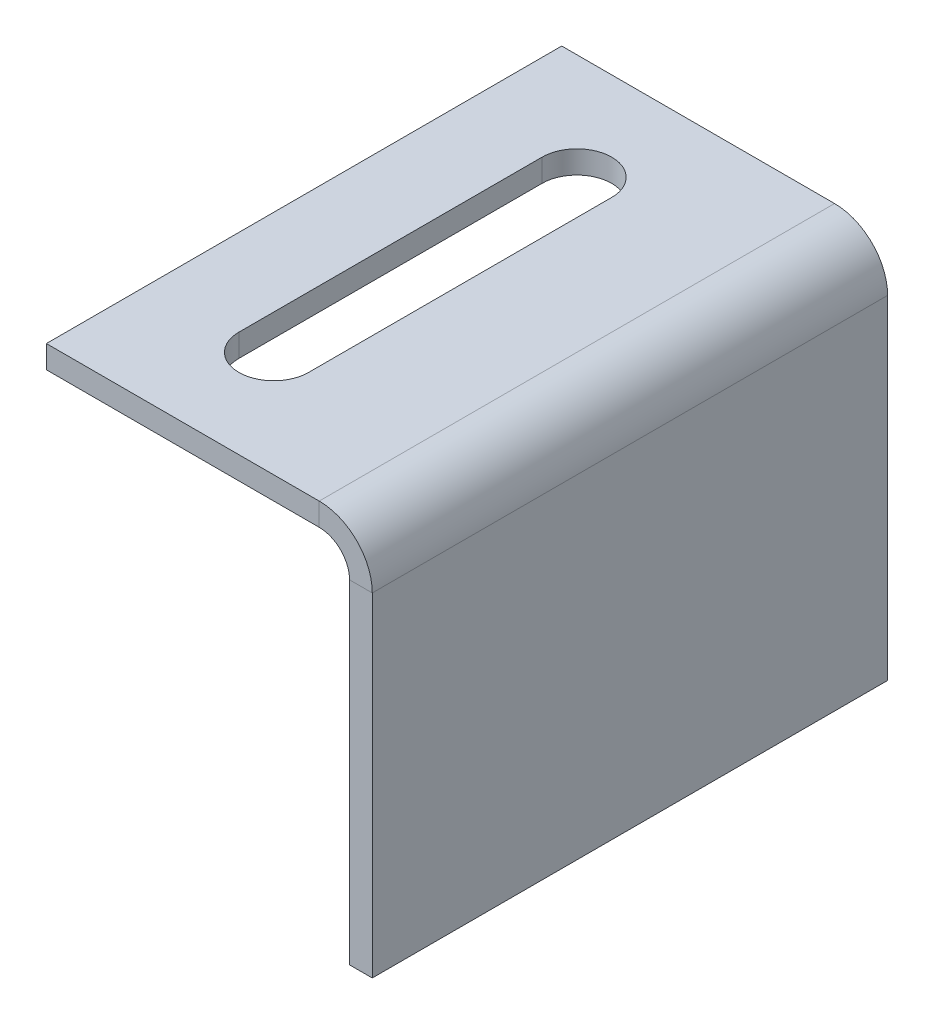
ISO-10303-21;
HEADER;
FILE_DESCRIPTION(('STEP AP214'),'2;1');
FILE_NAME('part.step','',(''),(''),'','','');
FILE_SCHEMA(('AUTOMOTIVE_DESIGN { 1 0 10303 214 1 1 1 1 }'));
ENDSEC;
DATA;
#1=APPLICATION_CONTEXT('core data for automotive mechanical design processes');
#2=APPLICATION_PROTOCOL_DEFINITION('international standard','automotive_design',2000,#1);
#3=PRODUCT_CONTEXT('',#1,'mechanical');
#4=PRODUCT('Part','Part','',(#3));
#5=PRODUCT_RELATED_PRODUCT_CATEGORY('part','',(#4));
#6=PRODUCT_DEFINITION_FORMATION('','',#4);
#7=PRODUCT_DEFINITION_CONTEXT('part definition',#1,'design');
#8=PRODUCT_DEFINITION('design','',#6,#7);
#9=PRODUCT_DEFINITION_SHAPE('','',#8);
#10=(LENGTH_UNIT() NAMED_UNIT(*) SI_UNIT(.MILLI.,.METRE.));
#11=(NAMED_UNIT(*) PLANE_ANGLE_UNIT() SI_UNIT($,.RADIAN.));
#12=(NAMED_UNIT(*) SI_UNIT($,.STERADIAN.) SOLID_ANGLE_UNIT());
#13=UNCERTAINTY_MEASURE_WITH_UNIT(LENGTH_MEASURE(1.E-05),#10,'distance_accuracy_value','');
#14=(GEOMETRIC_REPRESENTATION_CONTEXT(3) GLOBAL_UNCERTAINTY_ASSIGNED_CONTEXT((#13)) GLOBAL_UNIT_ASSIGNED_CONTEXT((#10,
#11,#12)) REPRESENTATION_CONTEXT('',''));
#15=CARTESIAN_POINT('',(0.,0.,0.));
#16=DIRECTION('',(0.,0.,1.));
#17=DIRECTION('',(1.,0.,0.));
#18=AXIS2_PLACEMENT_3D('',#15,#16,#17);
#19=CARTESIAN_POINT('',(-2.,24.,34.));
#20=DIRECTION('',(0.,0.,1.));
#21=DIRECTION('',(1.,0.,0.));
#22=AXIS2_PLACEMENT_3D('',#19,#20,#21);
#23=PLANE('',#22);
#24=DIRECTION('',(0.,1.,0.));
#25=VECTOR('',#24,1.);
#26=CARTESIAN_POINT('',(-2.,24.,34.));
#27=LINE('',#26,#25);
#28=CARTESIAN_POINT('',(-2.,24.,34.));
#29=VERTEX_POINT('',#28);
#30=CARTESIAN_POINT('',(-2.,25.5,34.));
#31=VERTEX_POINT('',#30);
#32=EDGE_CURVE('E223',#29,#31,#27,.T.);
#33=ORIENTED_EDGE('',*,*,#32,.F.);
#34=CARTESIAN_POINT('',(-2.,22.,34.));
#35=DIRECTION('',(0.,0.,-1.));
#36=DIRECTION('',(-1.,0.,0.));
#37=AXIS2_PLACEMENT_3D('',#34,#35,#36);
#38=CIRCLE('',#37,2.);
#39=CARTESIAN_POINT('',(0.,22.,34.));
#40=VERTEX_POINT('',#39);
#41=EDGE_CURVE('E160',#40,#29,#38,.F.);
#42=ORIENTED_EDGE('',*,*,#41,.F.);
#43=DIRECTION('',(-1.,0.,0.));
#44=VECTOR('',#43,1.);
#45=CARTESIAN_POINT('',(1.5,22.,34.));
#46=LINE('',#45,#44);
#47=CARTESIAN_POINT('',(1.5,22.,34.));
#48=VERTEX_POINT('',#47);
#49=EDGE_CURVE('E221',#48,#40,#46,.T.);
#50=ORIENTED_EDGE('',*,*,#49,.F.);
#51=CARTESIAN_POINT('',(-2.,22.,34.));
#52=DIRECTION('',(0.,0.,1.));
#53=DIRECTION('',(1.,0.,0.));
#54=AXIS2_PLACEMENT_3D('',#51,#52,#53);
#55=CIRCLE('',#54,3.5);
#56=EDGE_CURVE('E172',#48,#31,#55,.T.);
#57=ORIENTED_EDGE('',*,*,#56,.T.);
#58=EDGE_LOOP('',(#33,#42,#50,#57));
#59=FACE_BOUND('',#58,.T.);
#60=ADVANCED_FACE('F35',(#59),#23,.T.);
#61=CARTESIAN_POINT('',(1.5,22.,34.));
#62=DIRECTION('',(0.,0.,1.));
#63=DIRECTION('',(1.,0.,0.));
#64=AXIS2_PLACEMENT_3D('',#61,#62,#63);
#65=PLANE('',#64);
#66=DIRECTION('',(-1.,0.,0.));
#67=VECTOR('',#66,1.);
#68=CARTESIAN_POINT('',(0.,24.,34.));
#69=LINE('',#68,#67);
#70=CARTESIAN_POINT('',(-20.,24.,34.));
#71=VERTEX_POINT('',#70);
#72=EDGE_CURVE('E157',#29,#71,#69,.T.);
#73=ORIENTED_EDGE('',*,*,#72,.F.);
#74=ORIENTED_EDGE('',*,*,#32,.T.);
#75=DIRECTION('',(-1.,0.,0.));
#76=VECTOR('',#75,1.);
#77=CARTESIAN_POINT('',(0.,25.5,34.));
#78=LINE('',#77,#76);
#79=CARTESIAN_POINT('',(-20.,25.5,34.));
#80=VERTEX_POINT('',#79);
#81=EDGE_CURVE('E151',#31,#80,#78,.T.);
#82=ORIENTED_EDGE('',*,*,#81,.T.);
#83=DIRECTION('',(0.,1.,0.));
#84=VECTOR('',#83,1.);
#85=CARTESIAN_POINT('',(-20.,24.,34.));
#86=LINE('',#85,#84);
#87=EDGE_CURVE('E153',#71,#80,#86,.T.);
#88=ORIENTED_EDGE('',*,*,#87,.F.);
#89=EDGE_LOOP('',(#73,#74,#82,#88));
#90=FACE_BOUND('',#89,.T.);
#91=ADVANCED_FACE('F250',(#90),#65,.T.);
#92=CARTESIAN_POINT('',(0.,22.,0.));
#93=DIRECTION('',(0.,0.,-1.));
#94=DIRECTION('',(-1.,0.,0.));
#95=AXIS2_PLACEMENT_3D('',#92,#93,#94);
#96=PLANE('',#95);
#97=DIRECTION('',(1.,0.,0.));
#98=VECTOR('',#97,1.);
#99=CARTESIAN_POINT('',(0.,22.,0.));
#100=LINE('',#99,#98);
#101=CARTESIAN_POINT('',(0.,22.,0.));
#102=VERTEX_POINT('',#101);
#103=CARTESIAN_POINT('',(1.5,22.,0.));
#104=VERTEX_POINT('',#103);
#105=EDGE_CURVE('E219',#102,#104,#100,.T.);
#106=ORIENTED_EDGE('',*,*,#105,.F.);
#107=CARTESIAN_POINT('',(-2.,22.,0.));
#108=DIRECTION('',(0.,0.,-1.));
#109=DIRECTION('',(-1.,0.,0.));
#110=AXIS2_PLACEMENT_3D('',#107,#108,#109);
#111=CIRCLE('',#110,2.);
#112=CARTESIAN_POINT('',(-2.,24.,0.));
#113=VERTEX_POINT('',#112);
#114=EDGE_CURVE('E184',#102,#113,#111,.F.);
#115=ORIENTED_EDGE('',*,*,#114,.T.);
#116=DIRECTION('',(0.,-1.,0.));
#117=VECTOR('',#116,1.);
#118=CARTESIAN_POINT('',(-2.,25.5,0.));
#119=LINE('',#118,#117);
#120=CARTESIAN_POINT('',(-2.,25.5,0.));
#121=VERTEX_POINT('',#120);
#122=EDGE_CURVE('E217',#121,#113,#119,.T.);
#123=ORIENTED_EDGE('',*,*,#122,.F.);
#124=CARTESIAN_POINT('',(-2.,22.,0.));
#125=DIRECTION('',(0.,0.,1.));
#126=DIRECTION('',(1.,0.,0.));
#127=AXIS2_PLACEMENT_3D('',#124,#125,#126);
#128=CIRCLE('',#127,3.5);
#129=EDGE_CURVE('E154',#104,#121,#128,.T.);
#130=ORIENTED_EDGE('',*,*,#129,.F.);
#131=EDGE_LOOP('',(#106,#115,#123,#130));
#132=FACE_BOUND('',#131,.T.);
#133=ADVANCED_FACE('F255',(#132),#96,.T.);
#134=CARTESIAN_POINT('',(-2.,25.5,0.));
#135=DIRECTION('',(0.,0.,-1.));
#136=DIRECTION('',(-1.,0.,0.));
#137=AXIS2_PLACEMENT_3D('',#134,#135,#136);
#138=PLANE('',#137);
#139=DIRECTION('',(0.,1.,0.));
#140=VECTOR('',#139,1.);
#141=CARTESIAN_POINT('',(0.,0.,0.));
#142=LINE('',#141,#140);
#143=CARTESIAN_POINT('',(0.,0.,0.));
#144=VERTEX_POINT('',#143);
#145=EDGE_CURVE('E187',#144,#102,#142,.T.);
#146=ORIENTED_EDGE('',*,*,#145,.T.);
#147=ORIENTED_EDGE('',*,*,#105,.T.);
#148=DIRECTION('',(0.,1.,0.));
#149=VECTOR('',#148,1.);
#150=CARTESIAN_POINT('',(1.5,0.,0.));
#151=LINE('',#150,#149);
#152=CARTESIAN_POINT('',(1.5,0.,0.));
#153=VERTEX_POINT('',#152);
#154=EDGE_CURVE('E193',#153,#104,#151,.T.);
#155=ORIENTED_EDGE('',*,*,#154,.F.);
#156=DIRECTION('',(-1.,0.,0.));
#157=VECTOR('',#156,1.);
#158=CARTESIAN_POINT('',(1.5,0.,0.));
#159=LINE('',#158,#157);
#160=EDGE_CURVE('E190',#153,#144,#159,.T.);
#161=ORIENTED_EDGE('',*,*,#160,.T.);
#162=EDGE_LOOP('',(#146,#147,#155,#161));
#163=FACE_BOUND('',#162,.T.);
#164=ADVANCED_FACE('F293',(#163),#138,.T.);
#165=CARTESIAN_POINT('',(0.,25.5,34.));
#166=DIRECTION('',(0.,-1.,0.));
#167=DIRECTION('',(1.,0.,0.));
#168=AXIS2_PLACEMENT_3D('',#165,#166,#167);
#169=PLANE('',#168);
#170=DIRECTION('',(0.,0.,1.));
#171=VECTOR('',#170,1.);
#172=CARTESIAN_POINT('',(-14.3,25.5,7.));
#173=LINE('',#172,#171);
#174=CARTESIAN_POINT('',(-14.3,25.5,7.));
#175=VERTEX_POINT('',#174);
#176=CARTESIAN_POINT('',(-14.3,25.5,27.));
#177=VERTEX_POINT('',#176);
#178=EDGE_CURVE('E134',#175,#177,#173,.T.);
#179=ORIENTED_EDGE('',*,*,#178,.F.);
#180=CARTESIAN_POINT('',(-12.,25.5,7.));
#181=DIRECTION('',(0.,1.,0.));
#182=DIRECTION('',(-1.,0.,0.));
#183=AXIS2_PLACEMENT_3D('',#180,#181,#182);
#184=CIRCLE('',#183,2.3);
#185=CARTESIAN_POINT('',(-9.70000000000001,25.5,7.));
#186=VERTEX_POINT('',#185);
#187=EDGE_CURVE('E49',#186,#175,#184,.T.);
#188=ORIENTED_EDGE('',*,*,#187,.F.);
#189=DIRECTION('',(0.,0.,-1.));
#190=VECTOR('',#189,1.);
#191=CARTESIAN_POINT('',(-9.70000000000001,25.5,7.));
#192=LINE('',#191,#190);
#193=CARTESIAN_POINT('',(-9.70000000000001,25.5,27.));
#194=VERTEX_POINT('',#193);
#195=EDGE_CURVE('E141',#194,#186,#192,.T.);
#196=ORIENTED_EDGE('',*,*,#195,.F.);
#197=CARTESIAN_POINT('',(-12.,25.5,27.));
#198=DIRECTION('',(0.,1.,0.));
#199=DIRECTION('',(-1.,0.,0.));
#200=AXIS2_PLACEMENT_3D('',#197,#198,#199);
#201=CIRCLE('',#200,2.3);
#202=EDGE_CURVE('E125',#177,#194,#201,.T.);
#203=ORIENTED_EDGE('',*,*,#202,.F.);
#204=EDGE_LOOP('',(#179,#188,#196,#203));
#205=FACE_BOUND('',#204,.T.);
#206=DIRECTION('',(-1.,0.,0.));
#207=VECTOR('',#206,1.);
#208=CARTESIAN_POINT('',(0.,25.5,0.));
#209=LINE('',#208,#207);
#210=CARTESIAN_POINT('',(-20.,25.5,0.));
#211=VERTEX_POINT('',#210);
#212=EDGE_CURVE('E148',#121,#211,#209,.T.);
#213=ORIENTED_EDGE('',*,*,#212,.T.);
#214=DIRECTION('',(0.,0.,-1.));
#215=VECTOR('',#214,1.);
#216=CARTESIAN_POINT('',(-20.,25.5,34.));
#217=LINE('',#216,#215);
#218=EDGE_CURVE('E215',#80,#211,#217,.T.);
#219=ORIENTED_EDGE('',*,*,#218,.F.);
#220=ORIENTED_EDGE('',*,*,#81,.F.);
#221=DIRECTION('',(0.,0.,-1.));
#222=VECTOR('',#221,1.);
#223=CARTESIAN_POINT('',(-2.,25.5,34.));
#224=LINE('',#223,#222);
#225=EDGE_CURVE('E175',#31,#121,#224,.T.);
#226=ORIENTED_EDGE('',*,*,#225,.T.);
#227=EDGE_LOOP('',(#213,#219,#220,#226));
#228=FACE_BOUND('',#227,.T.);
#229=ADVANCED_FACE('F138',(#205,#228),#169,.F.);
#230=CARTESIAN_POINT('',(-20.,24.,34.));
#231=DIRECTION('',(-1.,0.,0.));
#232=DIRECTION('',(0.,0.,1.));
#233=AXIS2_PLACEMENT_3D('',#230,#231,#232);
#234=PLANE('',#233);
#235=DIRECTION('',(0.,1.,0.));
#236=VECTOR('',#235,1.);
#237=CARTESIAN_POINT('',(-20.,24.,0.));
#238=LINE('',#237,#236);
#239=CARTESIAN_POINT('',(-20.,24.,0.));
#240=VERTEX_POINT('',#239);
#241=EDGE_CURVE('E178',#240,#211,#238,.T.);
#242=ORIENTED_EDGE('',*,*,#241,.F.);
#243=DIRECTION('',(0.,0.,-1.));
#244=VECTOR('',#243,1.);
#245=CARTESIAN_POINT('',(-20.,24.,34.));
#246=LINE('',#245,#244);
#247=EDGE_CURVE('E213',#71,#240,#246,.T.);
#248=ORIENTED_EDGE('',*,*,#247,.F.);
#249=ORIENTED_EDGE('',*,*,#87,.T.);
#250=ORIENTED_EDGE('',*,*,#218,.T.);
#251=EDGE_LOOP('',(#242,#248,#249,#250));
#252=FACE_BOUND('',#251,.T.);
#253=ADVANCED_FACE('F290',(#252),#234,.T.);
#254=CARTESIAN_POINT('',(0.,24.,34.));
#255=DIRECTION('',(0.,-1.,0.));
#256=DIRECTION('',(1.,0.,0.));
#257=AXIS2_PLACEMENT_3D('',#254,#255,#256);
#258=PLANE('',#257);
#259=CARTESIAN_POINT('',(-12.,24.,7.));
#260=DIRECTION('',(0.,-1.,0.));
#261=DIRECTION('',(1.,0.,0.));
#262=AXIS2_PLACEMENT_3D('',#259,#260,#261);
#263=CIRCLE('',#262,2.3);
#264=CARTESIAN_POINT('',(-14.3,24.,7.));
#265=VERTEX_POINT('',#264);
#266=CARTESIAN_POINT('',(-9.70000000000001,24.,7.));
#267=VERTEX_POINT('',#266);
#268=EDGE_CURVE('E11',#265,#267,#263,.T.);
#269=ORIENTED_EDGE('',*,*,#268,.F.);
#270=DIRECTION('',(0.,0.,-1.));
#271=VECTOR('',#270,1.);
#272=CARTESIAN_POINT('',(-14.3,24.,34.));
#273=LINE('',#272,#271);
#274=CARTESIAN_POINT('',(-14.3,24.,27.));
#275=VERTEX_POINT('',#274);
#276=EDGE_CURVE('E225',#275,#265,#273,.T.);
#277=ORIENTED_EDGE('',*,*,#276,.F.);
#278=CARTESIAN_POINT('',(-12.,24.,27.));
#279=DIRECTION('',(0.,-1.,0.));
#280=DIRECTION('',(1.,0.,0.));
#281=AXIS2_PLACEMENT_3D('',#278,#279,#280);
#282=CIRCLE('',#281,2.3);
#283=CARTESIAN_POINT('',(-9.70000000000001,24.,27.));
#284=VERTEX_POINT('',#283);
#285=EDGE_CURVE('E128',#284,#275,#282,.T.);
#286=ORIENTED_EDGE('',*,*,#285,.F.);
#287=DIRECTION('',(0.,0.,1.));
#288=VECTOR('',#287,1.);
#289=CARTESIAN_POINT('',(-9.70000000000001,24.,34.));
#290=LINE('',#289,#288);
#291=EDGE_CURVE('E42',#267,#284,#290,.T.);
#292=ORIENTED_EDGE('',*,*,#291,.F.);
#293=EDGE_LOOP('',(#269,#277,#286,#292));
#294=FACE_BOUND('',#293,.T.);
#295=DIRECTION('',(-1.,0.,0.));
#296=VECTOR('',#295,1.);
#297=CARTESIAN_POINT('',(0.,24.,0.));
#298=LINE('',#297,#296);
#299=EDGE_CURVE('E181',#113,#240,#298,.T.);
#300=ORIENTED_EDGE('',*,*,#299,.F.);
#301=DIRECTION('',(0.,0.,-1.));
#302=VECTOR('',#301,1.);
#303=CARTESIAN_POINT('',(-2.,24.,34.));
#304=LINE('',#303,#302);
#305=EDGE_CURVE('E210',#29,#113,#304,.T.);
#306=ORIENTED_EDGE('',*,*,#305,.F.);
#307=ORIENTED_EDGE('',*,*,#72,.T.);
#308=ORIENTED_EDGE('',*,*,#247,.T.);
#309=EDGE_LOOP('',(#300,#306,#307,#308));
#310=FACE_BOUND('',#309,.T.);
#311=ADVANCED_FACE('F233',(#294,#310),#258,.T.);
#312=CARTESIAN_POINT('',(-2.,22.,34.));
#313=DIRECTION('',(0.,0.,-1.));
#314=DIRECTION('',(-1.,0.,0.));
#315=AXIS2_PLACEMENT_3D('',#312,#313,#314);
#316=CYLINDRICAL_SURFACE('',#315,2.);
#317=ORIENTED_EDGE('',*,*,#114,.F.);
#318=DIRECTION('',(0.,0.,-1.));
#319=VECTOR('',#318,1.);
#320=CARTESIAN_POINT('',(0.,22.,34.));
#321=LINE('',#320,#319);
#322=EDGE_CURVE('E207',#40,#102,#321,.T.);
#323=ORIENTED_EDGE('',*,*,#322,.F.);
#324=ORIENTED_EDGE('',*,*,#41,.T.);
#325=ORIENTED_EDGE('',*,*,#305,.T.);
#326=EDGE_LOOP('',(#317,#323,#324,#325));
#327=FACE_BOUND('',#326,.T.);
#328=ADVANCED_FACE('F267',(#327),#316,.F.);
#329=CARTESIAN_POINT('',(0.,0.,34.));
#330=DIRECTION('',(-1.,0.,0.));
#331=DIRECTION('',(0.,0.,1.));
#332=AXIS2_PLACEMENT_3D('',#329,#330,#331);
#333=PLANE('',#332);
#334=ORIENTED_EDGE('',*,*,#145,.F.);
#335=DIRECTION('',(0.,0.,-1.));
#336=VECTOR('',#335,1.);
#337=CARTESIAN_POINT('',(0.,0.,34.));
#338=LINE('',#337,#336);
#339=CARTESIAN_POINT('',(0.,0.,34.));
#340=VERTEX_POINT('',#339);
#341=EDGE_CURVE('E205',#340,#144,#338,.T.);
#342=ORIENTED_EDGE('',*,*,#341,.F.);
#343=DIRECTION('',(0.,1.,0.));
#344=VECTOR('',#343,1.);
#345=CARTESIAN_POINT('',(0.,0.,34.));
#346=LINE('',#345,#344);
#347=EDGE_CURVE('E163',#340,#40,#346,.T.);
#348=ORIENTED_EDGE('',*,*,#347,.T.);
#349=ORIENTED_EDGE('',*,*,#322,.T.);
#350=EDGE_LOOP('',(#334,#342,#348,#349));
#351=FACE_BOUND('',#350,.T.);
#352=ADVANCED_FACE('F270',(#351),#333,.T.);
#353=CARTESIAN_POINT('',(1.5,0.,34.));
#354=DIRECTION('',(0.,-1.,0.));
#355=DIRECTION('',(0.,0.,-1.));
#356=AXIS2_PLACEMENT_3D('',#353,#354,#355);
#357=PLANE('',#356);
#358=ORIENTED_EDGE('',*,*,#160,.F.);
#359=DIRECTION('',(0.,0.,-1.));
#360=VECTOR('',#359,1.);
#361=CARTESIAN_POINT('',(1.5,0.,34.));
#362=LINE('',#361,#360);
#363=CARTESIAN_POINT('',(1.5,0.,34.));
#364=VERTEX_POINT('',#363);
#365=EDGE_CURVE('E203',#364,#153,#362,.T.);
#366=ORIENTED_EDGE('',*,*,#365,.F.);
#367=DIRECTION('',(-1.,0.,0.));
#368=VECTOR('',#367,1.);
#369=CARTESIAN_POINT('',(1.5,0.,34.));
#370=LINE('',#369,#368);
#371=EDGE_CURVE('E166',#364,#340,#370,.T.);
#372=ORIENTED_EDGE('',*,*,#371,.T.);
#373=ORIENTED_EDGE('',*,*,#341,.T.);
#374=EDGE_LOOP('',(#358,#366,#372,#373));
#375=FACE_BOUND('',#374,.T.);
#376=ADVANCED_FACE('F276',(#375),#357,.T.);
#377=CARTESIAN_POINT('',(1.5,0.,34.));
#378=DIRECTION('',(-1.,0.,0.));
#379=DIRECTION('',(0.,0.,1.));
#380=AXIS2_PLACEMENT_3D('',#377,#378,#379);
#381=PLANE('',#380);
#382=ORIENTED_EDGE('',*,*,#154,.T.);
#383=DIRECTION('',(0.,0.,-1.));
#384=VECTOR('',#383,1.);
#385=CARTESIAN_POINT('',(1.5,22.,34.));
#386=LINE('',#385,#384);
#387=EDGE_CURVE('E200',#48,#104,#386,.T.);
#388=ORIENTED_EDGE('',*,*,#387,.F.);
#389=DIRECTION('',(0.,1.,0.));
#390=VECTOR('',#389,1.);
#391=CARTESIAN_POINT('',(1.5,0.,34.));
#392=LINE('',#391,#390);
#393=EDGE_CURVE('E169',#364,#48,#392,.T.);
#394=ORIENTED_EDGE('',*,*,#393,.F.);
#395=ORIENTED_EDGE('',*,*,#365,.T.);
#396=EDGE_LOOP('',(#382,#388,#394,#395));
#397=FACE_BOUND('',#396,.T.);
#398=ADVANCED_FACE('F281',(#397),#381,.F.);
#399=CARTESIAN_POINT('',(-2.,22.,34.));
#400=DIRECTION('',(0.,0.,-1.));
#401=DIRECTION('',(-1.,0.,0.));
#402=AXIS2_PLACEMENT_3D('',#399,#400,#401);
#403=CYLINDRICAL_SURFACE('',#402,3.5);
#404=ORIENTED_EDGE('',*,*,#129,.T.);
#405=ORIENTED_EDGE('',*,*,#225,.F.);
#406=ORIENTED_EDGE('',*,*,#56,.F.);
#407=ORIENTED_EDGE('',*,*,#387,.T.);
#408=EDGE_LOOP('',(#404,#405,#406,#407));
#409=FACE_BOUND('',#408,.T.);
#410=ADVANCED_FACE('F284',(#409),#403,.T.);
#411=CARTESIAN_POINT('',(-2.,22.,34.));
#412=DIRECTION('',(0.,0.,-1.));
#413=DIRECTION('',(-1.,0.,0.));
#414=AXIS2_PLACEMENT_3D('',#411,#412,#413);
#415=PLANE('',#414);
#416=ORIENTED_EDGE('',*,*,#393,.T.);
#417=ORIENTED_EDGE('',*,*,#49,.T.);
#418=ORIENTED_EDGE('',*,*,#347,.F.);
#419=ORIENTED_EDGE('',*,*,#371,.F.);
#420=EDGE_LOOP('',(#416,#417,#418,#419));
#421=FACE_BOUND('',#420,.T.);
#422=ADVANCED_FACE('F244',(#421),#415,.F.);
#423=CARTESIAN_POINT('',(-2.,22.,0.));
#424=DIRECTION('',(0.,0.,-1.));
#425=DIRECTION('',(-1.,0.,0.));
#426=AXIS2_PLACEMENT_3D('',#423,#424,#425);
#427=PLANE('',#426);
#428=ORIENTED_EDGE('',*,*,#212,.F.);
#429=ORIENTED_EDGE('',*,*,#122,.T.);
#430=ORIENTED_EDGE('',*,*,#299,.T.);
#431=ORIENTED_EDGE('',*,*,#241,.T.);
#432=EDGE_LOOP('',(#428,#429,#430,#431));
#433=FACE_BOUND('',#432,.T.);
#434=ADVANCED_FACE('F237',(#433),#427,.T.);
#435=CARTESIAN_POINT('',(-12.,15.5,7.));
#436=DIRECTION('',(0.,1.,0.));
#437=DIRECTION('',(-1.,0.,0.));
#438=AXIS2_PLACEMENT_3D('',#435,#436,#437);
#439=CYLINDRICAL_SURFACE('',#438,2.3);
#440=ORIENTED_EDGE('',*,*,#268,.T.);
#441=DIRECTION('',(0.,1.,0.));
#442=VECTOR('',#441,1.);
#443=CARTESIAN_POINT('',(-9.70000000000001,15.5,7.));
#444=LINE('',#443,#442);
#445=EDGE_CURVE('E146',#267,#186,#444,.T.);
#446=ORIENTED_EDGE('',*,*,#445,.T.);
#447=ORIENTED_EDGE('',*,*,#187,.T.);
#448=DIRECTION('',(0.,1.,0.));
#449=VECTOR('',#448,1.);
#450=CARTESIAN_POINT('',(-14.3,15.5,7.));
#451=LINE('',#450,#449);
#452=EDGE_CURVE('E131',#265,#175,#451,.T.);
#453=ORIENTED_EDGE('',*,*,#452,.F.);
#454=EDGE_LOOP('',(#440,#446,#447,#453));
#455=FACE_BOUND('',#454,.T.);
#456=ADVANCED_FACE('F235',(#455),#439,.F.);
#457=CARTESIAN_POINT('',(-9.70000000000001,15.5,7.));
#458=DIRECTION('',(1.,0.,0.));
#459=DIRECTION('',(0.,1.,0.));
#460=AXIS2_PLACEMENT_3D('',#457,#458,#459);
#461=PLANE('',#460);
#462=ORIENTED_EDGE('',*,*,#291,.T.);
#463=DIRECTION('',(0.,1.,0.));
#464=VECTOR('',#463,1.);
#465=CARTESIAN_POINT('',(-9.70000000000001,15.5,27.));
#466=LINE('',#465,#464);
#467=EDGE_CURVE('E130',#284,#194,#466,.T.);
#468=ORIENTED_EDGE('',*,*,#467,.T.);
#469=ORIENTED_EDGE('',*,*,#195,.T.);
#470=ORIENTED_EDGE('',*,*,#445,.F.);
#471=EDGE_LOOP('',(#462,#468,#469,#470));
#472=FACE_BOUND('',#471,.T.);
#473=ADVANCED_FACE('F230',(#472),#461,.F.);
#474=CARTESIAN_POINT('',(-12.,15.5,27.));
#475=DIRECTION('',(0.,1.,0.));
#476=DIRECTION('',(-1.,0.,0.));
#477=AXIS2_PLACEMENT_3D('',#474,#475,#476);
#478=CYLINDRICAL_SURFACE('',#477,2.3);
#479=ORIENTED_EDGE('',*,*,#285,.T.);
#480=DIRECTION('',(0.,1.,0.));
#481=VECTOR('',#480,1.);
#482=CARTESIAN_POINT('',(-14.3,15.5,27.));
#483=LINE('',#482,#481);
#484=EDGE_CURVE('E57',#275,#177,#483,.T.);
#485=ORIENTED_EDGE('',*,*,#484,.T.);
#486=ORIENTED_EDGE('',*,*,#202,.T.);
#487=ORIENTED_EDGE('',*,*,#467,.F.);
#488=EDGE_LOOP('',(#479,#485,#486,#487));
#489=FACE_BOUND('',#488,.T.);
#490=ADVANCED_FACE('F122',(#489),#478,.F.);
#491=CARTESIAN_POINT('',(-14.3,15.5,7.));
#492=DIRECTION('',(-1.,0.,0.));
#493=DIRECTION('',(0.,0.,1.));
#494=AXIS2_PLACEMENT_3D('',#491,#492,#493);
#495=PLANE('',#494);
#496=ORIENTED_EDGE('',*,*,#276,.T.);
#497=ORIENTED_EDGE('',*,*,#452,.T.);
#498=ORIENTED_EDGE('',*,*,#178,.T.);
#499=ORIENTED_EDGE('',*,*,#484,.F.);
#500=EDGE_LOOP('',(#496,#497,#498,#499));
#501=FACE_BOUND('',#500,.T.);
#502=ADVANCED_FACE('F135',(#501),#495,.F.);
#503=CLOSED_SHELL('',(#60,#91,#133,#164,#229,#253,#311,#328,#352,#376,#398,#410,#422,#434,#456,
#473,#490,#502));
#504=MANIFOLD_SOLID_BREP('B2',#503);
#505=ADVANCED_BREP_SHAPE_REPRESENTATION('',(#18,#504),#14);
#506=SHAPE_DEFINITION_REPRESENTATION(#9,#505);
ENDSEC;
END-ISO-10303-21;
